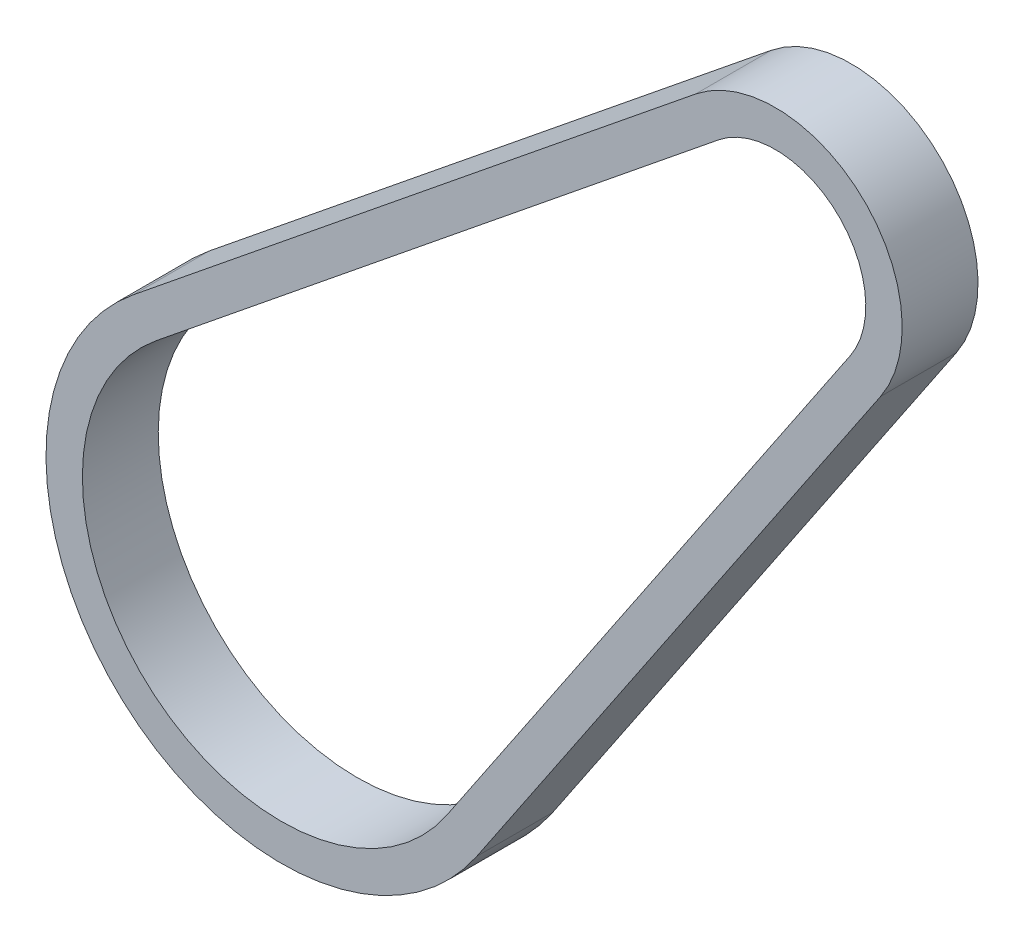
ISO-10303-21;
HEADER;
FILE_DESCRIPTION(('STEP AP214'),'2;1');
FILE_NAME('part.step','',(''),(''),'','','');
FILE_SCHEMA(('AUTOMOTIVE_DESIGN { 1 0 10303 214 1 1 1 1 }'));
ENDSEC;
DATA;
#1=APPLICATION_CONTEXT('core data for automotive mechanical design processes');
#2=APPLICATION_PROTOCOL_DEFINITION('international standard','automotive_design',2000,#1);
#3=PRODUCT_CONTEXT('',#1,'mechanical');
#4=PRODUCT('Part','Part','',(#3));
#5=PRODUCT_RELATED_PRODUCT_CATEGORY('part','',(#4));
#6=PRODUCT_DEFINITION_FORMATION('','',#4);
#7=PRODUCT_DEFINITION_CONTEXT('part definition',#1,'design');
#8=PRODUCT_DEFINITION('design','',#6,#7);
#9=PRODUCT_DEFINITION_SHAPE('','',#8);
#10=(LENGTH_UNIT() NAMED_UNIT(*) SI_UNIT(.MILLI.,.METRE.));
#11=(NAMED_UNIT(*) PLANE_ANGLE_UNIT() SI_UNIT($,.RADIAN.));
#12=(NAMED_UNIT(*) SI_UNIT($,.STERADIAN.) SOLID_ANGLE_UNIT());
#13=UNCERTAINTY_MEASURE_WITH_UNIT(LENGTH_MEASURE(1.E-05),#10,'distance_accuracy_value','');
#14=(GEOMETRIC_REPRESENTATION_CONTEXT(3) GLOBAL_UNCERTAINTY_ASSIGNED_CONTEXT((#13)) GLOBAL_UNIT_ASSIGNED_CONTEXT((#10,
#11,#12)) REPRESENTATION_CONTEXT('',''));
#15=CARTESIAN_POINT('',(0.,0.,0.));
#16=DIRECTION('',(0.,0.,1.));
#17=DIRECTION('',(1.,0.,0.));
#18=AXIS2_PLACEMENT_3D('',#15,#16,#17);
#19=CARTESIAN_POINT('',(32.5605341061844,35.5626399488961,-5.));
#20=DIRECTION('',(0.,0.,1.));
#21=DIRECTION('',(1.,0.,0.));
#22=AXIS2_PLACEMENT_3D('',#19,#20,#21);
#23=CYLINDRICAL_SURFACE('',#22,8.36197243913529);
#24=CARTESIAN_POINT('',(32.5605341061844,35.5626399488961,0.));
#25=DIRECTION('',(0.,0.,-1.));
#26=DIRECTION('',(-1.,0.,0.));
#27=AXIS2_PLACEMENT_3D('',#24,#25,#26);
#28=CIRCLE('',#27,8.36197243913529);
#29=CARTESIAN_POINT('',(39.498257331222,30.8946018678998,0.));
#30=VERTEX_POINT('',#29);
#31=CARTESIAN_POINT('',(27.3003031678909,42.0628363727497,0.));
#32=VERTEX_POINT('',#31);
#33=EDGE_CURVE('E157',#30,#32,#28,.F.);
#34=ORIENTED_EDGE('',*,*,#33,.F.);
#35=DIRECTION('',(0.,0.,1.));
#36=VECTOR('',#35,1.);
#37=CARTESIAN_POINT('',(39.498257331222,30.8946018678998,-5.));
#38=LINE('',#37,#36);
#39=CARTESIAN_POINT('',(39.498257331222,30.8946018678998,-5.));
#40=VERTEX_POINT('',#39);
#41=EDGE_CURVE('E12',#40,#30,#38,.T.);
#42=ORIENTED_EDGE('',*,*,#41,.F.);
#43=CARTESIAN_POINT('',(32.5605341061844,35.5626399488961,-5.));
#44=DIRECTION('',(0.,0.,-1.));
#45=DIRECTION('',(-1.,0.,0.));
#46=AXIS2_PLACEMENT_3D('',#43,#44,#45);
#47=CIRCLE('',#46,8.36197243913529);
#48=CARTESIAN_POINT('',(27.3003031678909,42.0628363727497,-5.));
#49=VERTEX_POINT('',#48);
#50=EDGE_CURVE('E161',#40,#49,#47,.F.);
#51=ORIENTED_EDGE('',*,*,#50,.T.);
#52=DIRECTION('',(0.,0.,1.));
#53=VECTOR('',#52,1.);
#54=CARTESIAN_POINT('',(27.3003031678909,42.0628363727497,-5.));
#55=LINE('',#54,#53);
#56=EDGE_CURVE('E62',#49,#32,#55,.T.);
#57=ORIENTED_EDGE('',*,*,#56,.T.);
#58=EDGE_LOOP('',(#34,#42,#51,#57));
#59=FACE_BOUND('',#58,.T.);
#60=ADVANCED_FACE('F59',(#59),#23,.T.);
#61=CARTESIAN_POINT('',(39.498257331222,30.8946018678998,-5.));
#62=DIRECTION('',(0.829675447454002,-0.558246049598205,0.));
#63=DIRECTION('',(0.558246049598205,0.829675447454002,0.));
#64=AXIS2_PLACEMENT_3D('',#61,#62,#63);
#65=PLANE('',#64);
#66=DIRECTION('',(0.558246049598205,0.829675447454002,0.));
#67=VECTOR('',#66,1.);
#68=CARTESIAN_POINT('',(39.498257331222,30.8946018678998,0.));
#69=LINE('',#68,#67);
#70=CARTESIAN_POINT('',(12.8798359131304,-8.66618090247481,0.));
#71=VERTEX_POINT('',#70);
#72=EDGE_CURVE('E165',#71,#30,#69,.T.);
#73=ORIENTED_EDGE('',*,*,#72,.F.);
#74=DIRECTION('',(0.,0.,1.));
#75=VECTOR('',#74,1.);
#76=CARTESIAN_POINT('',(12.8798359131304,-8.66618090247481,-5.));
#77=LINE('',#76,#75);
#78=CARTESIAN_POINT('',(12.8798359131304,-8.66618090247481,-5.));
#79=VERTEX_POINT('',#78);
#80=EDGE_CURVE('E67',#79,#71,#77,.T.);
#81=ORIENTED_EDGE('',*,*,#80,.F.);
#82=DIRECTION('',(0.558246049598205,0.829675447454002,0.));
#83=VECTOR('',#82,1.);
#84=CARTESIAN_POINT('',(39.498257331222,30.8946018678998,-5.));
#85=LINE('',#84,#83);
#86=EDGE_CURVE('E171',#79,#40,#85,.T.);
#87=ORIENTED_EDGE('',*,*,#86,.T.);
#88=ORIENTED_EDGE('',*,*,#41,.T.);
#89=EDGE_LOOP('',(#73,#81,#87,#88));
#90=FACE_BOUND('',#89,.T.);
#91=ADVANCED_FACE('F197',(#90),#65,.T.);
#92=CARTESIAN_POINT('',(0.,0.,-5.));
#93=DIRECTION('',(0.,0.,1.));
#94=DIRECTION('',(1.,0.,0.));
#95=AXIS2_PLACEMENT_3D('',#92,#93,#94);
#96=CYLINDRICAL_SURFACE('',#95,15.5239448782706);
#97=CARTESIAN_POINT('',(0.,0.,0.));
#98=DIRECTION('',(0.,0.,-1.));
#99=DIRECTION('',(-1.,0.,0.));
#100=AXIS2_PLACEMENT_3D('',#97,#98,#99);
#101=CIRCLE('',#100,15.5239448782706);
#102=CARTESIAN_POINT('',(-9.76558290850879,12.0675703868105,0.));
#103=VERTEX_POINT('',#102);
#104=EDGE_CURVE('E179',#103,#71,#101,.F.);
#105=ORIENTED_EDGE('',*,*,#104,.F.);
#106=DIRECTION('',(0.,0.,1.));
#107=VECTOR('',#106,1.);
#108=CARTESIAN_POINT('',(-9.76558290850879,12.0675703868105,-5.));
#109=LINE('',#108,#107);
#110=CARTESIAN_POINT('',(-9.76558290850879,12.0675703868105,-5.));
#111=VERTEX_POINT('',#110);
#112=EDGE_CURVE('E184',#111,#103,#109,.T.);
#113=ORIENTED_EDGE('',*,*,#112,.F.);
#114=CARTESIAN_POINT('',(0.,0.,-5.));
#115=DIRECTION('',(0.,0.,-1.));
#116=DIRECTION('',(-1.,0.,0.));
#117=AXIS2_PLACEMENT_3D('',#114,#115,#116);
#118=CIRCLE('',#117,15.5239448782706);
#119=EDGE_CURVE('E168',#111,#79,#118,.F.);
#120=ORIENTED_EDGE('',*,*,#119,.T.);
#121=ORIENTED_EDGE('',*,*,#80,.T.);
#122=EDGE_LOOP('',(#105,#113,#120,#121));
#123=FACE_BOUND('',#122,.T.);
#124=ADVANCED_FACE('F201',(#123),#96,.T.);
#125=CARTESIAN_POINT('',(27.3003031678909,42.0628363727497,-5.));
#126=DIRECTION('',(-0.629065806731768,0.777352050747221,0.));
#127=DIRECTION('',(-0.777352050747221,-0.629065806731768,0.));
#128=AXIS2_PLACEMENT_3D('',#125,#126,#127);
#129=PLANE('',#128);
#130=DIRECTION('',(-0.777352050747221,-0.629065806731768,0.));
#131=VECTOR('',#130,1.);
#132=CARTESIAN_POINT('',(27.3003031678909,42.0628363727497,0.));
#133=LINE('',#132,#131);
#134=EDGE_CURVE('E176',#32,#103,#133,.T.);
#135=ORIENTED_EDGE('',*,*,#134,.F.);
#136=ORIENTED_EDGE('',*,*,#56,.F.);
#137=DIRECTION('',(-0.777352050747221,-0.629065806731768,0.));
#138=VECTOR('',#137,1.);
#139=CARTESIAN_POINT('',(27.3003031678909,42.0628363727497,-5.));
#140=LINE('',#139,#138);
#141=EDGE_CURVE('E164',#49,#111,#140,.T.);
#142=ORIENTED_EDGE('',*,*,#141,.T.);
#143=ORIENTED_EDGE('',*,*,#112,.T.);
#144=EDGE_LOOP('',(#135,#136,#142,#143));
#145=FACE_BOUND('',#144,.T.);
#146=ADVANCED_FACE('F192',(#145),#129,.T.);
#147=CARTESIAN_POINT('',(32.5605341061844,35.5626399488961,-5.));
#148=DIRECTION('',(0.,0.,-1.));
#149=DIRECTION('',(-1.,0.,0.));
#150=AXIS2_PLACEMENT_3D('',#147,#148,#149);
#151=PLANE('',#150);
#152=CARTESIAN_POINT('',(32.5605341061844,35.5626399488961,-5.));
#153=DIRECTION('',(0.,0.,-1.));
#154=DIRECTION('',(-1.,0.,0.));
#155=AXIS2_PLACEMENT_3D('',#152,#153,#154);
#156=CIRCLE('',#155,5.96197243913529);
#157=CARTESIAN_POINT('',(37.5070362573324,32.2343923869355,-5.));
#158=VERTEX_POINT('',#157);
#159=CARTESIAN_POINT('',(28.8100611040472,40.1971914509564,-5.));
#160=VERTEX_POINT('',#159);
#161=EDGE_CURVE('E126',#158,#160,#156,.F.);
#162=ORIENTED_EDGE('',*,*,#161,.T.);
#163=DIRECTION('',(-0.777352050747221,-0.629065806731768,0.));
#164=VECTOR('',#163,1.);
#165=CARTESIAN_POINT('',(28.8100611040472,40.1971914509564,-5.));
#166=LINE('',#165,#164);
#167=CARTESIAN_POINT('',(-8.25582497235255,10.2019254650172,-5.));
#168=VERTEX_POINT('',#167);
#169=EDGE_CURVE('E135',#160,#168,#166,.T.);
#170=ORIENTED_EDGE('',*,*,#169,.T.);
#171=CARTESIAN_POINT('',(0.,0.,-5.));
#172=DIRECTION('',(0.,0.,-1.));
#173=DIRECTION('',(-1.,0.,0.));
#174=AXIS2_PLACEMENT_3D('',#171,#172,#173);
#175=CIRCLE('',#174,13.1239448782706);
#176=CARTESIAN_POINT('',(10.8886148392408,-7.32639038343912,-5.));
#177=VERTEX_POINT('',#176);
#178=EDGE_CURVE('E75',#168,#177,#175,.F.);
#179=ORIENTED_EDGE('',*,*,#178,.T.);
#180=DIRECTION('',(0.558246049598205,0.829675447454002,0.));
#181=VECTOR('',#180,1.);
#182=CARTESIAN_POINT('',(37.5070362573324,32.2343923869355,-5.));
#183=LINE('',#182,#181);
#184=EDGE_CURVE('E132',#177,#158,#183,.T.);
#185=ORIENTED_EDGE('',*,*,#184,.T.);
#186=EDGE_LOOP('',(#162,#170,#179,#185));
#187=FACE_BOUND('',#186,.T.);
#188=ORIENTED_EDGE('',*,*,#50,.F.);
#189=ORIENTED_EDGE('',*,*,#86,.F.);
#190=ORIENTED_EDGE('',*,*,#119,.F.);
#191=ORIENTED_EDGE('',*,*,#141,.F.);
#192=EDGE_LOOP('',(#188,#189,#190,#191));
#193=FACE_BOUND('',#192,.T.);
#194=ADVANCED_FACE('F139',(#187,#193),#151,.T.);
#195=CARTESIAN_POINT('',(32.5605341061844,35.5626399488961,0.));
#196=DIRECTION('',(0.,0.,-1.));
#197=DIRECTION('',(-1.,0.,0.));
#198=AXIS2_PLACEMENT_3D('',#195,#196,#197);
#199=PLANE('',#198);
#200=DIRECTION('',(-0.777352050747221,-0.629065806731768,0.));
#201=VECTOR('',#200,1.);
#202=CARTESIAN_POINT('',(28.8100611040472,40.1971914509564,0.));
#203=LINE('',#202,#201);
#204=CARTESIAN_POINT('',(28.8100611040472,40.1971914509564,0.));
#205=VERTEX_POINT('',#204);
#206=CARTESIAN_POINT('',(-8.25582497235255,10.2019254650171,0.));
#207=VERTEX_POINT('',#206);
#208=EDGE_CURVE('E151',#205,#207,#203,.T.);
#209=ORIENTED_EDGE('',*,*,#208,.F.);
#210=CARTESIAN_POINT('',(32.5605341061844,35.5626399488961,0.));
#211=DIRECTION('',(0.,0.,-1.));
#212=DIRECTION('',(-1.,0.,0.));
#213=AXIS2_PLACEMENT_3D('',#210,#211,#212);
#214=CIRCLE('',#213,5.96197243913529);
#215=CARTESIAN_POINT('',(37.5070362573324,32.2343923869355,0.));
#216=VERTEX_POINT('',#215);
#217=EDGE_CURVE('E83',#216,#205,#214,.F.);
#218=ORIENTED_EDGE('',*,*,#217,.F.);
#219=DIRECTION('',(0.558246049598205,0.829675447454002,0.));
#220=VECTOR('',#219,1.);
#221=CARTESIAN_POINT('',(37.5070362573324,32.2343923869355,0.));
#222=LINE('',#221,#220);
#223=CARTESIAN_POINT('',(10.8886148392408,-7.32639038343912,0.));
#224=VERTEX_POINT('',#223);
#225=EDGE_CURVE('E142',#224,#216,#222,.T.);
#226=ORIENTED_EDGE('',*,*,#225,.F.);
#227=CARTESIAN_POINT('',(0.,0.,0.));
#228=DIRECTION('',(0.,0.,-1.));
#229=DIRECTION('',(-1.,0.,0.));
#230=AXIS2_PLACEMENT_3D('',#227,#228,#229);
#231=CIRCLE('',#230,13.1239448782706);
#232=EDGE_CURVE('E145',#207,#224,#231,.F.);
#233=ORIENTED_EDGE('',*,*,#232,.F.);
#234=EDGE_LOOP('',(#209,#218,#226,#233));
#235=FACE_BOUND('',#234,.T.);
#236=ORIENTED_EDGE('',*,*,#33,.T.);
#237=ORIENTED_EDGE('',*,*,#134,.T.);
#238=ORIENTED_EDGE('',*,*,#104,.T.);
#239=ORIENTED_EDGE('',*,*,#72,.T.);
#240=EDGE_LOOP('',(#236,#237,#238,#239));
#241=FACE_BOUND('',#240,.T.);
#242=ADVANCED_FACE('F194',(#235,#241),#199,.F.);
#243=CARTESIAN_POINT('',(32.5605341061844,35.5626399488961,-5.));
#244=DIRECTION('',(0.,0.,1.));
#245=DIRECTION('',(1.,0.,0.));
#246=AXIS2_PLACEMENT_3D('',#243,#244,#245);
#247=CYLINDRICAL_SURFACE('',#246,5.96197243913529);
#248=ORIENTED_EDGE('',*,*,#217,.T.);
#249=DIRECTION('',(0.,0.,1.));
#250=VECTOR('',#249,1.);
#251=CARTESIAN_POINT('',(28.8100611040472,40.1971914509564,-5.));
#252=LINE('',#251,#250);
#253=EDGE_CURVE('E122',#160,#205,#252,.T.);
#254=ORIENTED_EDGE('',*,*,#253,.F.);
#255=ORIENTED_EDGE('',*,*,#161,.F.);
#256=DIRECTION('',(0.,0.,1.));
#257=VECTOR('',#256,1.);
#258=CARTESIAN_POINT('',(37.5070362573324,32.2343923869355,-5.));
#259=LINE('',#258,#257);
#260=EDGE_CURVE('E155',#158,#216,#259,.T.);
#261=ORIENTED_EDGE('',*,*,#260,.T.);
#262=EDGE_LOOP('',(#248,#254,#255,#261));
#263=FACE_BOUND('',#262,.T.);
#264=ADVANCED_FACE('F124',(#263),#247,.F.);
#265=CARTESIAN_POINT('',(37.5070362573324,32.2343923869355,-5.));
#266=DIRECTION('',(0.829675447454002,-0.558246049598205,0.));
#267=DIRECTION('',(0.558246049598205,0.829675447454002,0.));
#268=AXIS2_PLACEMENT_3D('',#265,#266,#267);
#269=PLANE('',#268);
#270=ORIENTED_EDGE('',*,*,#225,.T.);
#271=ORIENTED_EDGE('',*,*,#260,.F.);
#272=ORIENTED_EDGE('',*,*,#184,.F.);
#273=DIRECTION('',(0.,0.,1.));
#274=VECTOR('',#273,1.);
#275=CARTESIAN_POINT('',(10.8886148392408,-7.32639038343912,-5.));
#276=LINE('',#275,#274);
#277=EDGE_CURVE('E158',#177,#224,#276,.T.);
#278=ORIENTED_EDGE('',*,*,#277,.T.);
#279=EDGE_LOOP('',(#270,#271,#272,#278));
#280=FACE_BOUND('',#279,.T.);
#281=ADVANCED_FACE('F252',(#280),#269,.F.);
#282=CARTESIAN_POINT('',(0.,0.,-5.));
#283=DIRECTION('',(0.,0.,1.));
#284=DIRECTION('',(1.,0.,0.));
#285=AXIS2_PLACEMENT_3D('',#282,#283,#284);
#286=CYLINDRICAL_SURFACE('',#285,13.1239448782706);
#287=ORIENTED_EDGE('',*,*,#232,.T.);
#288=ORIENTED_EDGE('',*,*,#277,.F.);
#289=ORIENTED_EDGE('',*,*,#178,.F.);
#290=DIRECTION('',(0.,0.,1.));
#291=VECTOR('',#290,1.);
#292=CARTESIAN_POINT('',(-8.25582497235255,10.2019254650171,-5.));
#293=LINE('',#292,#291);
#294=EDGE_CURVE('E131',#168,#207,#293,.T.);
#295=ORIENTED_EDGE('',*,*,#294,.T.);
#296=EDGE_LOOP('',(#287,#288,#289,#295));
#297=FACE_BOUND('',#296,.T.);
#298=ADVANCED_FACE('F261',(#297),#286,.F.);
#299=CARTESIAN_POINT('',(28.8100611040472,40.1971914509564,-5.));
#300=DIRECTION('',(-0.629065806731768,0.777352050747221,0.));
#301=DIRECTION('',(-0.777352050747221,-0.629065806731768,0.));
#302=AXIS2_PLACEMENT_3D('',#299,#300,#301);
#303=PLANE('',#302);
#304=ORIENTED_EDGE('',*,*,#208,.T.);
#305=ORIENTED_EDGE('',*,*,#294,.F.);
#306=ORIENTED_EDGE('',*,*,#169,.F.);
#307=ORIENTED_EDGE('',*,*,#253,.T.);
#308=EDGE_LOOP('',(#304,#305,#306,#307));
#309=FACE_BOUND('',#308,.T.);
#310=ADVANCED_FACE('F136',(#309),#303,.F.);
#311=CLOSED_SHELL('',(#60,#91,#124,#146,#194,#242,#264,#281,#298,#310));
#312=MANIFOLD_SOLID_BREP('B2',#311);
#313=ADVANCED_BREP_SHAPE_REPRESENTATION('',(#18,#312),#14);
#314=SHAPE_DEFINITION_REPRESENTATION(#9,#313);
ENDSEC;
END-ISO-10303-21;
